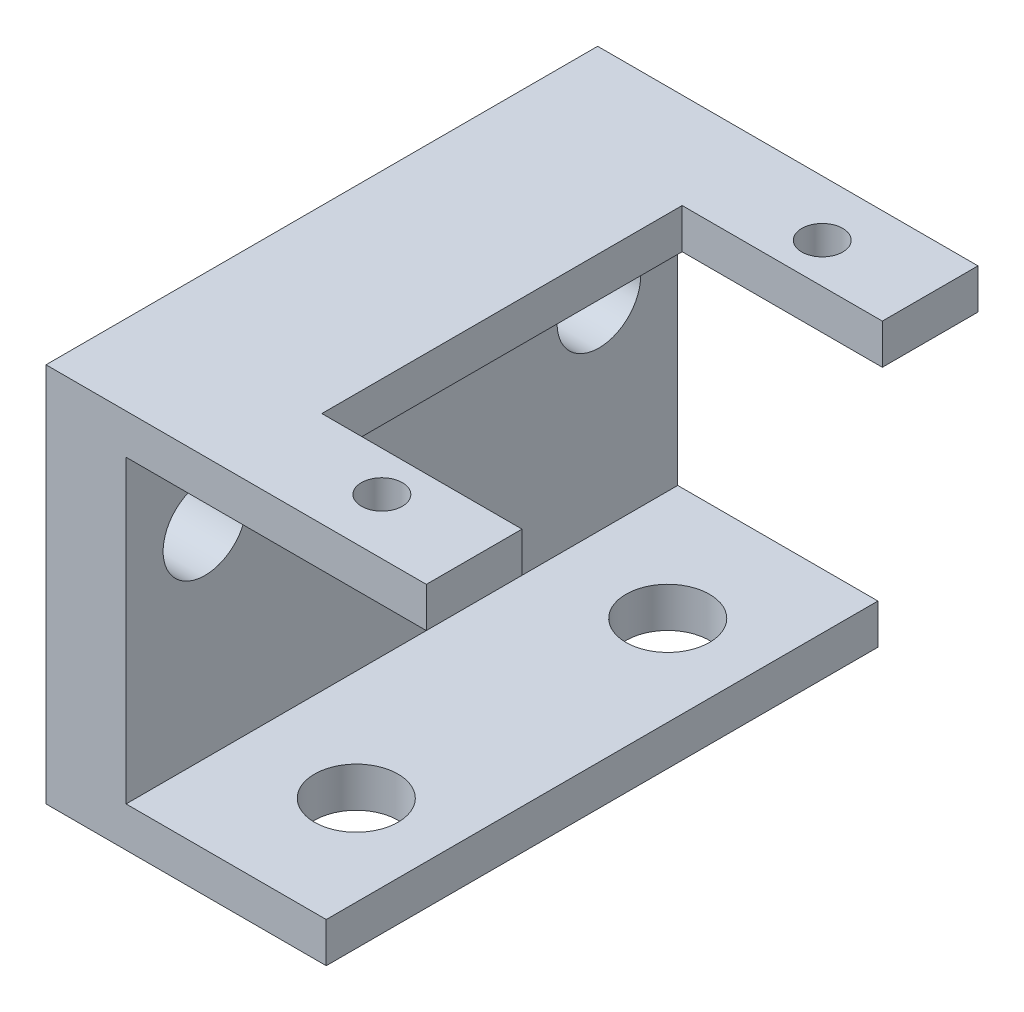
ISO-10303-21;
HEADER;
FILE_DESCRIPTION(('STEP AP214'),'2;1');
FILE_NAME('part.step','',(''),(''),'','','');
FILE_SCHEMA(('AUTOMOTIVE_DESIGN { 1 0 10303 214 1 1 1 1 }'));
ENDSEC;
DATA;
#1=APPLICATION_CONTEXT('core data for automotive mechanical design processes');
#2=APPLICATION_PROTOCOL_DEFINITION('international standard','automotive_design',2000,#1);
#3=PRODUCT_CONTEXT('',#1,'mechanical');
#4=PRODUCT('Part','Part','',(#3));
#5=PRODUCT_RELATED_PRODUCT_CATEGORY('part','',(#4));
#6=PRODUCT_DEFINITION_FORMATION('','',#4);
#7=PRODUCT_DEFINITION_CONTEXT('part definition',#1,'design');
#8=PRODUCT_DEFINITION('design','',#6,#7);
#9=PRODUCT_DEFINITION_SHAPE('','',#8);
#10=(LENGTH_UNIT() NAMED_UNIT(*) SI_UNIT(.MILLI.,.METRE.));
#11=(NAMED_UNIT(*) PLANE_ANGLE_UNIT() SI_UNIT($,.RADIAN.));
#12=(NAMED_UNIT(*) SI_UNIT($,.STERADIAN.) SOLID_ANGLE_UNIT());
#13=UNCERTAINTY_MEASURE_WITH_UNIT(LENGTH_MEASURE(1.E-05),#10,'distance_accuracy_value','');
#14=(GEOMETRIC_REPRESENTATION_CONTEXT(3) GLOBAL_UNCERTAINTY_ASSIGNED_CONTEXT((#13)) GLOBAL_UNIT_ASSIGNED_CONTEXT((#10,
#11,#12)) REPRESENTATION_CONTEXT('',''));
#15=CARTESIAN_POINT('',(0.,0.,0.));
#16=DIRECTION('',(0.,0.,1.));
#17=DIRECTION('',(1.,0.,0.));
#18=AXIS2_PLACEMENT_3D('',#15,#16,#17);
#19=CARTESIAN_POINT('',(24.13,0.,35.));
#20=DIRECTION('',(-1.,0.,0.));
#21=DIRECTION('',(0.,0.,1.));
#22=AXIS2_PLACEMENT_3D('',#19,#20,#21);
#23=PLANE('',#22);
#24=DIRECTION('',(0.,1.,0.));
#25=VECTOR('',#24,1.);
#26=CARTESIAN_POINT('',(24.13,-0.001000000000001,28.93));
#27=LINE('',#26,#25);
#28=CARTESIAN_POINT('',(24.13,21.59,28.93));
#29=VERTEX_POINT('',#28);
#30=CARTESIAN_POINT('',(24.13,24.13,28.93));
#31=VERTEX_POINT('',#30);
#32=EDGE_CURVE('E52',#29,#31,#27,.T.);
#33=ORIENTED_EDGE('',*,*,#32,.T.);
#34=DIRECTION('',(0.,0.,-1.));
#35=VECTOR('',#34,1.);
#36=CARTESIAN_POINT('',(24.13,24.13,35.));
#37=LINE('',#36,#35);
#38=CARTESIAN_POINT('',(24.13,24.13,35.));
#39=VERTEX_POINT('',#38);
#40=EDGE_CURVE('E172',#39,#31,#37,.T.);
#41=ORIENTED_EDGE('',*,*,#40,.F.);
#42=DIRECTION('',(0.,1.,0.));
#43=VECTOR('',#42,1.);
#44=CARTESIAN_POINT('',(24.13,0.,35.));
#45=LINE('',#44,#43);
#46=CARTESIAN_POINT('',(24.13,21.59,35.));
#47=VERTEX_POINT('',#46);
#48=EDGE_CURVE('E154',#47,#39,#45,.T.);
#49=ORIENTED_EDGE('',*,*,#48,.F.);
#50=DIRECTION('',(0.,0.,-1.));
#51=VECTOR('',#50,1.);
#52=CARTESIAN_POINT('',(24.13,21.59,35.));
#53=LINE('',#52,#51);
#54=EDGE_CURVE('E44',#47,#29,#53,.T.);
#55=ORIENTED_EDGE('',*,*,#54,.T.);
#56=EDGE_LOOP('',(#33,#41,#49,#55));
#57=FACE_BOUND('',#56,.T.);
#58=ADVANCED_FACE('F35',(#57),#23,.F.);
#59=CARTESIAN_POINT('',(0.,24.13,35.));
#60=DIRECTION('',(0.,1.,0.));
#61=DIRECTION('',(0.,0.,1.));
#62=AXIS2_PLACEMENT_3D('',#59,#60,#61);
#63=PLANE('',#62);
#64=CARTESIAN_POINT('',(17.78,24.13,31.47));
#65=DIRECTION('',(0.,1.,0.));
#66=DIRECTION('',(0.,0.,1.));
#67=AXIS2_PLACEMENT_3D('',#64,#65,#66);
#68=CIRCLE('',#67,1.3);
#69=CARTESIAN_POINT('',(17.78,24.13,32.77));
#70=VERTEX_POINT('',#69);
#71=EDGE_CURVE('E374',#70,#70,#68,.T.);
#72=ORIENTED_EDGE('',*,*,#71,.F.);
#73=EDGE_LOOP('',(#72));
#74=FACE_BOUND('',#73,.T.);
#75=CARTESIAN_POINT('',(17.78,24.13,3.53));
#76=DIRECTION('',(0.,1.,0.));
#77=DIRECTION('',(0.,0.,1.));
#78=AXIS2_PLACEMENT_3D('',#75,#76,#77);
#79=CIRCLE('',#78,1.3);
#80=CARTESIAN_POINT('',(17.78,24.13,4.83));
#81=VERTEX_POINT('',#80);
#82=EDGE_CURVE('E243',#81,#81,#79,.T.);
#83=ORIENTED_EDGE('',*,*,#82,.F.);
#84=EDGE_LOOP('',(#83));
#85=FACE_BOUND('',#84,.T.);
#86=DIRECTION('',(-1.,0.,0.));
#87=VECTOR('',#86,1.);
#88=CARTESIAN_POINT('',(24.13,24.13,6.07));
#89=LINE('',#88,#87);
#90=CARTESIAN_POINT('',(24.13,24.13,6.07));
#91=VERTEX_POINT('',#90);
#92=CARTESIAN_POINT('',(11.43,24.13,6.07));
#93=VERTEX_POINT('',#92);
#94=EDGE_CURVE('E236',#91,#93,#89,.T.);
#95=ORIENTED_EDGE('',*,*,#94,.F.);
#96=CARTESIAN_POINT('',(24.13,24.13,0.));
#97=VERTEX_POINT('',#96);
#98=EDGE_CURVE('E171',#91,#97,#37,.T.);
#99=ORIENTED_EDGE('',*,*,#98,.T.);
#100=DIRECTION('',(1.,0.,0.));
#101=VECTOR('',#100,1.);
#102=CARTESIAN_POINT('',(0.,24.13,0.));
#103=LINE('',#102,#101);
#104=CARTESIAN_POINT('',(0.,24.13,0.));
#105=VERTEX_POINT('',#104);
#106=EDGE_CURVE('E107',#105,#97,#103,.T.);
#107=ORIENTED_EDGE('',*,*,#106,.F.);
#108=DIRECTION('',(0.,0.,-1.));
#109=VECTOR('',#108,1.);
#110=CARTESIAN_POINT('',(0.,24.13,35.));
#111=LINE('',#110,#109);
#112=CARTESIAN_POINT('',(0.,24.13,35.));
#113=VERTEX_POINT('',#112);
#114=EDGE_CURVE('E101',#113,#105,#111,.T.);
#115=ORIENTED_EDGE('',*,*,#114,.F.);
#116=DIRECTION('',(1.,0.,0.));
#117=VECTOR('',#116,1.);
#118=CARTESIAN_POINT('',(0.,24.13,35.));
#119=LINE('',#118,#117);
#120=EDGE_CURVE('E157',#113,#39,#119,.T.);
#121=ORIENTED_EDGE('',*,*,#120,.T.);
#122=ORIENTED_EDGE('',*,*,#40,.T.);
#123=DIRECTION('',(-1.,0.,0.));
#124=VECTOR('',#123,1.);
#125=CARTESIAN_POINT('',(24.13,24.13,28.93));
#126=LINE('',#125,#124);
#127=CARTESIAN_POINT('',(11.43,24.13,28.93));
#128=VERTEX_POINT('',#127);
#129=EDGE_CURVE('E248',#31,#128,#126,.T.);
#130=ORIENTED_EDGE('',*,*,#129,.T.);
#131=DIRECTION('',(0.,0.,1.));
#132=VECTOR('',#131,1.);
#133=CARTESIAN_POINT('',(11.43,24.13,6.07));
#134=LINE('',#133,#132);
#135=EDGE_CURVE('E251',#93,#128,#134,.T.);
#136=ORIENTED_EDGE('',*,*,#135,.F.);
#137=EDGE_LOOP('',(#95,#99,#107,#115,#121,#122,#130,#136));
#138=FACE_BOUND('',#137,.T.);
#139=ADVANCED_FACE('F297',(#74,#85,#138),#63,.T.);
#140=ORIENTED_EDGE('',*,*,#98,.F.);
#141=DIRECTION('',(0.,1.,0.));
#142=VECTOR('',#141,1.);
#143=CARTESIAN_POINT('',(24.13,-0.001000000000001,6.07));
#144=LINE('',#143,#142);
#145=CARTESIAN_POINT('',(24.13,21.59,6.07));
#146=VERTEX_POINT('',#145);
#147=EDGE_CURVE('E238',#146,#91,#144,.T.);
#148=ORIENTED_EDGE('',*,*,#147,.F.);
#149=CARTESIAN_POINT('',(24.13,21.59,0.));
#150=VERTEX_POINT('',#149);
#151=EDGE_CURVE('E175',#146,#150,#53,.T.);
#152=ORIENTED_EDGE('',*,*,#151,.T.);
#153=DIRECTION('',(0.,1.,0.));
#154=VECTOR('',#153,1.);
#155=CARTESIAN_POINT('',(24.13,0.,0.));
#156=LINE('',#155,#154);
#157=EDGE_CURVE('E165',#150,#97,#156,.T.);
#158=ORIENTED_EDGE('',*,*,#157,.T.);
#159=EDGE_LOOP('',(#140,#148,#152,#158));
#160=FACE_BOUND('',#159,.T.);
#161=ADVANCED_FACE('F300',(#160),#23,.F.);
#162=CARTESIAN_POINT('',(0.,0.,0.));
#163=DIRECTION('',(0.,0.,1.));
#164=DIRECTION('',(1.,0.,0.));
#165=AXIS2_PLACEMENT_3D('',#162,#163,#164);
#166=PLANE('',#165);
#167=DIRECTION('',(1.,0.,0.));
#168=VECTOR('',#167,1.);
#169=CARTESIAN_POINT('',(0.,21.59,0.));
#170=LINE('',#169,#168);
#171=CARTESIAN_POINT('',(5.08,21.59,0.));
#172=VERTEX_POINT('',#171);
#173=EDGE_CURVE('E162',#172,#150,#170,.T.);
#174=ORIENTED_EDGE('',*,*,#173,.F.);
#175=DIRECTION('',(0.,1.,0.));
#176=VECTOR('',#175,1.);
#177=CARTESIAN_POINT('',(5.08,2.54,0.));
#178=LINE('',#177,#176);
#179=CARTESIAN_POINT('',(5.08,2.54,0.));
#180=VERTEX_POINT('',#179);
#181=EDGE_CURVE('E115',#180,#172,#178,.T.);
#182=ORIENTED_EDGE('',*,*,#181,.F.);
#183=DIRECTION('',(1.,0.,0.));
#184=VECTOR('',#183,1.);
#185=CARTESIAN_POINT('',(0.,2.54,0.));
#186=LINE('',#185,#184);
#187=CARTESIAN_POINT('',(17.78,2.54,0.));
#188=VERTEX_POINT('',#187);
#189=EDGE_CURVE('E127',#180,#188,#186,.T.);
#190=ORIENTED_EDGE('',*,*,#189,.T.);
#191=DIRECTION('',(0.,1.,0.));
#192=VECTOR('',#191,1.);
#193=CARTESIAN_POINT('',(17.78,0.,0.));
#194=LINE('',#193,#192);
#195=CARTESIAN_POINT('',(17.78,0.,0.));
#196=VERTEX_POINT('',#195);
#197=EDGE_CURVE('E122',#196,#188,#194,.T.);
#198=ORIENTED_EDGE('',*,*,#197,.F.);
#199=DIRECTION('',(1.,0.,0.));
#200=VECTOR('',#199,1.);
#201=CARTESIAN_POINT('',(0.,0.,0.));
#202=LINE('',#201,#200);
#203=CARTESIAN_POINT('',(0.,0.,0.));
#204=VERTEX_POINT('',#203);
#205=EDGE_CURVE('E112',#204,#196,#202,.T.);
#206=ORIENTED_EDGE('',*,*,#205,.F.);
#207=DIRECTION('',(0.,1.,0.));
#208=VECTOR('',#207,1.);
#209=CARTESIAN_POINT('',(0.,0.,0.));
#210=LINE('',#209,#208);
#211=EDGE_CURVE('E93',#204,#105,#210,.T.);
#212=ORIENTED_EDGE('',*,*,#211,.T.);
#213=ORIENTED_EDGE('',*,*,#106,.T.);
#214=ORIENTED_EDGE('',*,*,#157,.F.);
#215=EDGE_LOOP('',(#174,#182,#190,#198,#206,#212,#213,#214));
#216=FACE_BOUND('',#215,.T.);
#217=ADVANCED_FACE('F120',(#216),#166,.F.);
#218=CARTESIAN_POINT('',(0.,0.,35.));
#219=DIRECTION('',(0.,0.,1.));
#220=DIRECTION('',(1.,0.,0.));
#221=AXIS2_PLACEMENT_3D('',#218,#219,#220);
#222=PLANE('',#221);
#223=DIRECTION('',(0.,1.,0.));
#224=VECTOR('',#223,1.);
#225=CARTESIAN_POINT('',(0.,0.,35.));
#226=LINE('',#225,#224);
#227=CARTESIAN_POINT('',(0.,0.,35.));
#228=VERTEX_POINT('',#227);
#229=EDGE_CURVE('E160',#228,#113,#226,.T.);
#230=ORIENTED_EDGE('',*,*,#229,.F.);
#231=DIRECTION('',(1.,0.,0.));
#232=VECTOR('',#231,1.);
#233=CARTESIAN_POINT('',(0.,0.,35.));
#234=LINE('',#233,#232);
#235=CARTESIAN_POINT('',(17.78,0.,35.));
#236=VERTEX_POINT('',#235);
#237=EDGE_CURVE('E114',#228,#236,#234,.T.);
#238=ORIENTED_EDGE('',*,*,#237,.T.);
#239=DIRECTION('',(0.,1.,0.));
#240=VECTOR('',#239,1.);
#241=CARTESIAN_POINT('',(17.78,0.,35.));
#242=LINE('',#241,#240);
#243=CARTESIAN_POINT('',(17.78,2.54,35.));
#244=VERTEX_POINT('',#243);
#245=EDGE_CURVE('E125',#236,#244,#242,.T.);
#246=ORIENTED_EDGE('',*,*,#245,.T.);
#247=DIRECTION('',(1.,0.,0.));
#248=VECTOR('',#247,1.);
#249=CARTESIAN_POINT('',(0.,2.54,35.));
#250=LINE('',#249,#248);
#251=CARTESIAN_POINT('',(5.08,2.54,35.));
#252=VERTEX_POINT('',#251);
#253=EDGE_CURVE('E123',#252,#244,#250,.T.);
#254=ORIENTED_EDGE('',*,*,#253,.F.);
#255=DIRECTION('',(0.,1.,0.));
#256=VECTOR('',#255,1.);
#257=CARTESIAN_POINT('',(5.08,2.54,35.));
#258=LINE('',#257,#256);
#259=CARTESIAN_POINT('',(5.08,21.59,35.));
#260=VERTEX_POINT('',#259);
#261=EDGE_CURVE('E178',#252,#260,#258,.T.);
#262=ORIENTED_EDGE('',*,*,#261,.T.);
#263=DIRECTION('',(1.,0.,0.));
#264=VECTOR('',#263,1.);
#265=CARTESIAN_POINT('',(0.,21.59,35.));
#266=LINE('',#265,#264);
#267=EDGE_CURVE('E106',#260,#47,#266,.T.);
#268=ORIENTED_EDGE('',*,*,#267,.T.);
#269=ORIENTED_EDGE('',*,*,#48,.T.);
#270=ORIENTED_EDGE('',*,*,#120,.F.);
#271=EDGE_LOOP('',(#230,#238,#246,#254,#262,#268,#269,#270));
#272=FACE_BOUND('',#271,.T.);
#273=ADVANCED_FACE('F311',(#272),#222,.T.);
#274=CARTESIAN_POINT('',(0.,21.59,35.));
#275=DIRECTION('',(0.,1.,0.));
#276=DIRECTION('',(0.,0.,1.));
#277=AXIS2_PLACEMENT_3D('',#274,#275,#276);
#278=PLANE('',#277);
#279=CARTESIAN_POINT('',(17.78,21.59,31.47));
#280=DIRECTION('',(0.,1.,0.));
#281=DIRECTION('',(0.,0.,1.));
#282=AXIS2_PLACEMENT_3D('',#279,#280,#281);
#283=CIRCLE('',#282,1.3);
#284=CARTESIAN_POINT('',(17.78,21.59,32.77));
#285=VERTEX_POINT('',#284);
#286=EDGE_CURVE('E371',#285,#285,#283,.T.);
#287=ORIENTED_EDGE('',*,*,#286,.T.);
#288=EDGE_LOOP('',(#287));
#289=FACE_BOUND('',#288,.T.);
#290=CARTESIAN_POINT('',(17.78,21.59,3.53));
#291=DIRECTION('',(0.,1.,0.));
#292=DIRECTION('',(0.,0.,1.));
#293=AXIS2_PLACEMENT_3D('',#290,#291,#292);
#294=CIRCLE('',#293,1.3);
#295=CARTESIAN_POINT('',(17.78,21.59,4.83));
#296=VERTEX_POINT('',#295);
#297=EDGE_CURVE('E240',#296,#296,#294,.T.);
#298=ORIENTED_EDGE('',*,*,#297,.T.);
#299=EDGE_LOOP('',(#298));
#300=FACE_BOUND('',#299,.T.);
#301=ORIENTED_EDGE('',*,*,#151,.F.);
#302=DIRECTION('',(1.,0.,0.));
#303=VECTOR('',#302,1.);
#304=CARTESIAN_POINT('',(24.13,21.59,6.07));
#305=LINE('',#304,#303);
#306=CARTESIAN_POINT('',(11.43,21.59,6.07));
#307=VERTEX_POINT('',#306);
#308=EDGE_CURVE('E231',#307,#146,#305,.T.);
#309=ORIENTED_EDGE('',*,*,#308,.F.);
#310=DIRECTION('',(0.,0.,-1.));
#311=VECTOR('',#310,1.);
#312=CARTESIAN_POINT('',(11.43,21.59,6.07));
#313=LINE('',#312,#311);
#314=CARTESIAN_POINT('',(11.43,21.59,28.93));
#315=VERTEX_POINT('',#314);
#316=EDGE_CURVE('E223',#315,#307,#313,.T.);
#317=ORIENTED_EDGE('',*,*,#316,.F.);
#318=DIRECTION('',(1.,0.,0.));
#319=VECTOR('',#318,1.);
#320=CARTESIAN_POINT('',(24.13,21.59,28.93));
#321=LINE('',#320,#319);
#322=EDGE_CURVE('E230',#315,#29,#321,.T.);
#323=ORIENTED_EDGE('',*,*,#322,.T.);
#324=ORIENTED_EDGE('',*,*,#54,.F.);
#325=ORIENTED_EDGE('',*,*,#267,.F.);
#326=DIRECTION('',(0.,0.,-1.));
#327=VECTOR('',#326,1.);
#328=CARTESIAN_POINT('',(5.08,21.59,35.));
#329=LINE('',#328,#327);
#330=EDGE_CURVE('E11',#260,#172,#329,.T.);
#331=ORIENTED_EDGE('',*,*,#330,.T.);
#332=ORIENTED_EDGE('',*,*,#173,.T.);
#333=EDGE_LOOP('',(#301,#309,#317,#323,#324,#325,#331,#332));
#334=FACE_BOUND('',#333,.T.);
#335=ADVANCED_FACE('F186',(#289,#300,#334),#278,.F.);
#336=CARTESIAN_POINT('',(0.,0.,35.));
#337=DIRECTION('',(-1.,0.,0.));
#338=DIRECTION('',(0.,-1.,0.));
#339=AXIS2_PLACEMENT_3D('',#336,#337,#338);
#340=PLANE('',#339);
#341=CARTESIAN_POINT('',(0.,15.24,30.));
#342=DIRECTION('',(1.,0.,0.));
#343=DIRECTION('',(0.,0.,-1.));
#344=AXIS2_PLACEMENT_3D('',#341,#342,#343);
#345=CIRCLE('',#344,2.65);
#346=CARTESIAN_POINT('',(0.,15.24,27.35));
#347=VERTEX_POINT('',#346);
#348=EDGE_CURVE('E148',#347,#347,#345,.T.);
#349=ORIENTED_EDGE('',*,*,#348,.T.);
#350=EDGE_LOOP('',(#349));
#351=FACE_BOUND('',#350,.T.);
#352=CARTESIAN_POINT('',(0.,15.24,5.));
#353=DIRECTION('',(1.,0.,0.));
#354=DIRECTION('',(0.,0.,-1.));
#355=AXIS2_PLACEMENT_3D('',#352,#353,#354);
#356=CIRCLE('',#355,2.65);
#357=CARTESIAN_POINT('',(0.,15.24,2.35000000000001));
#358=VERTEX_POINT('',#357);
#359=EDGE_CURVE('E140',#358,#358,#356,.T.);
#360=ORIENTED_EDGE('',*,*,#359,.T.);
#361=EDGE_LOOP('',(#360));
#362=FACE_BOUND('',#361,.T.);
#363=ORIENTED_EDGE('',*,*,#211,.F.);
#364=DIRECTION('',(0.,0.,-1.));
#365=VECTOR('',#364,1.);
#366=CARTESIAN_POINT('',(0.,0.,35.));
#367=LINE('',#366,#365);
#368=EDGE_CURVE('E97',#228,#204,#367,.T.);
#369=ORIENTED_EDGE('',*,*,#368,.F.);
#370=ORIENTED_EDGE('',*,*,#229,.T.);
#371=ORIENTED_EDGE('',*,*,#114,.T.);
#372=EDGE_LOOP('',(#363,#369,#370,#371));
#373=FACE_BOUND('',#372,.T.);
#374=ADVANCED_FACE('F95',(#351,#362,#373),#340,.T.);
#375=CARTESIAN_POINT('',(0.,0.,35.));
#376=DIRECTION('',(0.,1.,0.));
#377=DIRECTION('',(0.,0.,1.));
#378=AXIS2_PLACEMENT_3D('',#375,#376,#377);
#379=PLANE('',#378);
#380=CARTESIAN_POINT('',(12.065,0.,27.38));
#381=DIRECTION('',(0.,1.,0.));
#382=DIRECTION('',(0.,0.,1.));
#383=AXIS2_PLACEMENT_3D('',#380,#381,#382);
#384=CIRCLE('',#383,2.65);
#385=CARTESIAN_POINT('',(12.065,0.,30.03));
#386=VERTEX_POINT('',#385);
#387=EDGE_CURVE('E260',#386,#386,#384,.T.);
#388=ORIENTED_EDGE('',*,*,#387,.T.);
#389=EDGE_LOOP('',(#388));
#390=FACE_BOUND('',#389,.T.);
#391=CARTESIAN_POINT('',(12.065,0.,7.62));
#392=DIRECTION('',(0.,1.,0.));
#393=DIRECTION('',(0.,0.,1.));
#394=AXIS2_PLACEMENT_3D('',#391,#392,#393);
#395=CIRCLE('',#394,2.65);
#396=CARTESIAN_POINT('',(12.065,0.,10.27));
#397=VERTEX_POINT('',#396);
#398=EDGE_CURVE('E266',#397,#397,#395,.T.);
#399=ORIENTED_EDGE('',*,*,#398,.T.);
#400=EDGE_LOOP('',(#399));
#401=FACE_BOUND('',#400,.T.);
#402=ORIENTED_EDGE('',*,*,#205,.T.);
#403=DIRECTION('',(0.,0.,-1.));
#404=VECTOR('',#403,1.);
#405=CARTESIAN_POINT('',(17.78,0.,35.));
#406=LINE('',#405,#404);
#407=EDGE_CURVE('E116',#236,#196,#406,.T.);
#408=ORIENTED_EDGE('',*,*,#407,.F.);
#409=ORIENTED_EDGE('',*,*,#237,.F.);
#410=ORIENTED_EDGE('',*,*,#368,.T.);
#411=EDGE_LOOP('',(#402,#408,#409,#410));
#412=FACE_BOUND('',#411,.T.);
#413=ADVANCED_FACE('F110',(#390,#401,#412),#379,.F.);
#414=CARTESIAN_POINT('',(17.78,0.,35.));
#415=DIRECTION('',(-1.,0.,0.));
#416=DIRECTION('',(0.,0.,1.));
#417=AXIS2_PLACEMENT_3D('',#414,#415,#416);
#418=PLANE('',#417);
#419=ORIENTED_EDGE('',*,*,#197,.T.);
#420=DIRECTION('',(0.,0.,-1.));
#421=VECTOR('',#420,1.);
#422=CARTESIAN_POINT('',(17.78,2.54,35.));
#423=LINE('',#422,#421);
#424=EDGE_CURVE('E39',#244,#188,#423,.T.);
#425=ORIENTED_EDGE('',*,*,#424,.F.);
#426=ORIENTED_EDGE('',*,*,#245,.F.);
#427=ORIENTED_EDGE('',*,*,#407,.T.);
#428=EDGE_LOOP('',(#419,#425,#426,#427));
#429=FACE_BOUND('',#428,.T.);
#430=ADVANCED_FACE('F291',(#429),#418,.F.);
#431=CARTESIAN_POINT('',(0.,2.54,35.));
#432=DIRECTION('',(0.,1.,0.));
#433=DIRECTION('',(0.,0.,1.));
#434=AXIS2_PLACEMENT_3D('',#431,#432,#433);
#435=PLANE('',#434);
#436=CARTESIAN_POINT('',(12.065,2.54,27.38));
#437=DIRECTION('',(0.,1.,0.));
#438=DIRECTION('',(0.,0.,1.));
#439=AXIS2_PLACEMENT_3D('',#436,#437,#438);
#440=CIRCLE('',#439,2.64999999999999);
#441=CARTESIAN_POINT('',(12.065,2.54,30.03));
#442=VERTEX_POINT('',#441);
#443=EDGE_CURVE('E257',#442,#442,#440,.T.);
#444=ORIENTED_EDGE('',*,*,#443,.F.);
#445=EDGE_LOOP('',(#444));
#446=FACE_BOUND('',#445,.T.);
#447=CARTESIAN_POINT('',(12.065,2.54,7.62));
#448=DIRECTION('',(0.,1.,0.));
#449=DIRECTION('',(0.,0.,1.));
#450=AXIS2_PLACEMENT_3D('',#447,#448,#449);
#451=CIRCLE('',#450,2.64999999999999);
#452=CARTESIAN_POINT('',(12.065,2.54,10.27));
#453=VERTEX_POINT('',#452);
#454=EDGE_CURVE('E263',#453,#453,#451,.T.);
#455=ORIENTED_EDGE('',*,*,#454,.F.);
#456=EDGE_LOOP('',(#455));
#457=FACE_BOUND('',#456,.T.);
#458=DIRECTION('',(0.,0.,-1.));
#459=VECTOR('',#458,1.);
#460=CARTESIAN_POINT('',(5.08,2.54,35.));
#461=LINE('',#460,#459);
#462=EDGE_CURVE('E166',#252,#180,#461,.T.);
#463=ORIENTED_EDGE('',*,*,#462,.F.);
#464=ORIENTED_EDGE('',*,*,#253,.T.);
#465=ORIENTED_EDGE('',*,*,#424,.T.);
#466=ORIENTED_EDGE('',*,*,#189,.F.);
#467=EDGE_LOOP('',(#463,#464,#465,#466));
#468=FACE_BOUND('',#467,.T.);
#469=ADVANCED_FACE('F37',(#446,#457,#468),#435,.T.);
#470=CARTESIAN_POINT('',(5.08,2.54,35.));
#471=DIRECTION('',(-1.,0.,0.));
#472=DIRECTION('',(0.,-1.,0.));
#473=AXIS2_PLACEMENT_3D('',#470,#471,#472);
#474=PLANE('',#473);
#475=CARTESIAN_POINT('',(5.08,15.24,30.));
#476=DIRECTION('',(1.,0.,0.));
#477=DIRECTION('',(0.,0.,-1.));
#478=AXIS2_PLACEMENT_3D('',#475,#476,#477);
#479=CIRCLE('',#478,2.65);
#480=CARTESIAN_POINT('',(5.08,15.24,27.35));
#481=VERTEX_POINT('',#480);
#482=EDGE_CURVE('E269',#481,#481,#479,.T.);
#483=ORIENTED_EDGE('',*,*,#482,.F.);
#484=EDGE_LOOP('',(#483));
#485=FACE_BOUND('',#484,.T.);
#486=CARTESIAN_POINT('',(5.08,15.24,5.));
#487=DIRECTION('',(1.,0.,0.));
#488=DIRECTION('',(0.,0.,-1.));
#489=AXIS2_PLACEMENT_3D('',#486,#487,#488);
#490=CIRCLE('',#489,2.65);
#491=CARTESIAN_POINT('',(5.08,15.24,2.35000000000001));
#492=VERTEX_POINT('',#491);
#493=EDGE_CURVE('E143',#492,#492,#490,.T.);
#494=ORIENTED_EDGE('',*,*,#493,.F.);
#495=EDGE_LOOP('',(#494));
#496=FACE_BOUND('',#495,.T.);
#497=ORIENTED_EDGE('',*,*,#181,.T.);
#498=ORIENTED_EDGE('',*,*,#330,.F.);
#499=ORIENTED_EDGE('',*,*,#261,.F.);
#500=ORIENTED_EDGE('',*,*,#462,.T.);
#501=EDGE_LOOP('',(#497,#498,#499,#500));
#502=FACE_BOUND('',#501,.T.);
#503=ADVANCED_FACE('F181',(#485,#496,#502),#474,.F.);
#504=CARTESIAN_POINT('',(5.08,15.24,5.));
#505=DIRECTION('',(1.,0.,0.));
#506=DIRECTION('',(0.,0.,-1.));
#507=AXIS2_PLACEMENT_3D('',#504,#505,#506);
#508=CYLINDRICAL_SURFACE('',#507,2.65);
#509=ORIENTED_EDGE('',*,*,#359,.F.);
#510=EDGE_LOOP('',(#509));
#511=FACE_BOUND('',#510,.T.);
#512=ORIENTED_EDGE('',*,*,#493,.T.);
#513=EDGE_LOOP('',(#512));
#514=FACE_BOUND('',#513,.T.);
#515=ADVANCED_FACE('F279',(#511,#514),#508,.F.);
#516=CARTESIAN_POINT('',(5.08,15.24,30.));
#517=DIRECTION('',(1.,0.,0.));
#518=DIRECTION('',(0.,0.,-1.));
#519=AXIS2_PLACEMENT_3D('',#516,#517,#518);
#520=CYLINDRICAL_SURFACE('',#519,2.65);
#521=ORIENTED_EDGE('',*,*,#348,.F.);
#522=EDGE_LOOP('',(#521));
#523=FACE_BOUND('',#522,.T.);
#524=ORIENTED_EDGE('',*,*,#482,.T.);
#525=EDGE_LOOP('',(#524));
#526=FACE_BOUND('',#525,.T.);
#527=ADVANCED_FACE('F275',(#523,#526),#520,.F.);
#528=CARTESIAN_POINT('',(12.065,2.54,7.62));
#529=DIRECTION('',(0.,1.,0.));
#530=DIRECTION('',(0.,0.,1.));
#531=AXIS2_PLACEMENT_3D('',#528,#529,#530);
#532=CYLINDRICAL_SURFACE('',#531,2.64999999999999);
#533=ORIENTED_EDGE('',*,*,#398,.F.);
#534=EDGE_LOOP('',(#533));
#535=FACE_BOUND('',#534,.T.);
#536=ORIENTED_EDGE('',*,*,#454,.T.);
#537=EDGE_LOOP('',(#536));
#538=FACE_BOUND('',#537,.T.);
#539=ADVANCED_FACE('F278',(#535,#538),#532,.F.);
#540=CARTESIAN_POINT('',(12.065,2.54,27.38));
#541=DIRECTION('',(0.,1.,0.));
#542=DIRECTION('',(0.,0.,1.));
#543=AXIS2_PLACEMENT_3D('',#540,#541,#542);
#544=CYLINDRICAL_SURFACE('',#543,2.64999999999999);
#545=ORIENTED_EDGE('',*,*,#387,.F.);
#546=EDGE_LOOP('',(#545));
#547=FACE_BOUND('',#546,.T.);
#548=ORIENTED_EDGE('',*,*,#443,.T.);
#549=EDGE_LOOP('',(#548));
#550=FACE_BOUND('',#549,.T.);
#551=ADVANCED_FACE('F343',(#547,#550),#544,.F.);
#552=CARTESIAN_POINT('',(24.13,-0.001000000000001,6.07));
#553=DIRECTION('',(0.,0.,-1.));
#554=DIRECTION('',(-1.,0.,0.));
#555=AXIS2_PLACEMENT_3D('',#552,#553,#554);
#556=PLANE('',#555);
#557=ORIENTED_EDGE('',*,*,#308,.T.);
#558=ORIENTED_EDGE('',*,*,#147,.T.);
#559=ORIENTED_EDGE('',*,*,#94,.T.);
#560=DIRECTION('',(0.,1.,0.));
#561=VECTOR('',#560,1.);
#562=CARTESIAN_POINT('',(11.43,-0.001000000000001,6.07));
#563=LINE('',#562,#561);
#564=EDGE_CURVE('E227',#307,#93,#563,.T.);
#565=ORIENTED_EDGE('',*,*,#564,.F.);
#566=EDGE_LOOP('',(#557,#558,#559,#565));
#567=FACE_BOUND('',#566,.T.);
#568=ADVANCED_FACE('F234',(#567),#556,.F.);
#569=CARTESIAN_POINT('',(11.43,-0.001000000000001,6.07));
#570=DIRECTION('',(-1.,0.,0.));
#571=DIRECTION('',(0.,0.,1.));
#572=AXIS2_PLACEMENT_3D('',#569,#570,#571);
#573=PLANE('',#572);
#574=ORIENTED_EDGE('',*,*,#316,.T.);
#575=ORIENTED_EDGE('',*,*,#564,.T.);
#576=ORIENTED_EDGE('',*,*,#135,.T.);
#577=DIRECTION('',(0.,1.,0.));
#578=VECTOR('',#577,1.);
#579=CARTESIAN_POINT('',(11.43,-0.001000000000001,28.93));
#580=LINE('',#579,#578);
#581=EDGE_CURVE('E229',#315,#128,#580,.T.);
#582=ORIENTED_EDGE('',*,*,#581,.F.);
#583=EDGE_LOOP('',(#574,#575,#576,#582));
#584=FACE_BOUND('',#583,.T.);
#585=ADVANCED_FACE('F225',(#584),#573,.F.);
#586=CARTESIAN_POINT('',(24.13,-0.001000000000001,28.93));
#587=DIRECTION('',(0.,0.,-1.));
#588=DIRECTION('',(-1.,0.,0.));
#589=AXIS2_PLACEMENT_3D('',#586,#587,#588);
#590=PLANE('',#589);
#591=ORIENTED_EDGE('',*,*,#581,.T.);
#592=ORIENTED_EDGE('',*,*,#129,.F.);
#593=ORIENTED_EDGE('',*,*,#32,.F.);
#594=ORIENTED_EDGE('',*,*,#322,.F.);
#595=EDGE_LOOP('',(#591,#592,#593,#594));
#596=FACE_BOUND('',#595,.T.);
#597=ADVANCED_FACE('F316',(#596),#590,.T.);
#598=CARTESIAN_POINT('',(17.78,24.13,3.53));
#599=DIRECTION('',(0.,1.,0.));
#600=DIRECTION('',(0.,0.,1.));
#601=AXIS2_PLACEMENT_3D('',#598,#599,#600);
#602=CYLINDRICAL_SURFACE('',#601,1.3);
#603=ORIENTED_EDGE('',*,*,#297,.F.);
#604=EDGE_LOOP('',(#603));
#605=FACE_BOUND('',#604,.T.);
#606=ORIENTED_EDGE('',*,*,#82,.T.);
#607=EDGE_LOOP('',(#606));
#608=FACE_BOUND('',#607,.T.);
#609=ADVANCED_FACE('F355',(#605,#608),#602,.F.);
#610=CARTESIAN_POINT('',(17.78,24.13,31.47));
#611=DIRECTION('',(0.,1.,0.));
#612=DIRECTION('',(0.,0.,1.));
#613=AXIS2_PLACEMENT_3D('',#610,#611,#612);
#614=CYLINDRICAL_SURFACE('',#613,1.3);
#615=ORIENTED_EDGE('',*,*,#286,.F.);
#616=EDGE_LOOP('',(#615));
#617=FACE_BOUND('',#616,.T.);
#618=ORIENTED_EDGE('',*,*,#71,.T.);
#619=EDGE_LOOP('',(#618));
#620=FACE_BOUND('',#619,.T.);
#621=ADVANCED_FACE('F362',(#617,#620),#614,.F.);
#622=CLOSED_SHELL('',(#58,#139,#161,#217,#273,#335,#374,#413,#430,#469,#503,#515,#527,#539,#551,
#568,#585,#597,#609,#621));
#623=MANIFOLD_SOLID_BREP('B2',#622);
#624=ADVANCED_BREP_SHAPE_REPRESENTATION('',(#18,#623),#14);
#625=SHAPE_DEFINITION_REPRESENTATION(#9,#624);
ENDSEC;
END-ISO-10303-21;
